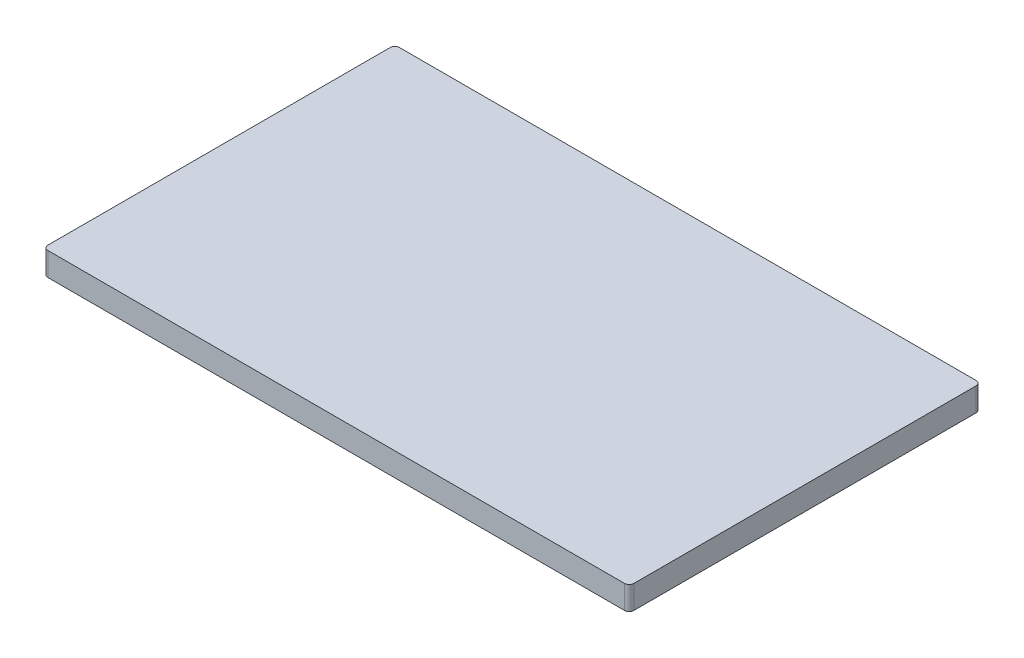
ISO-10303-21;
HEADER;
FILE_DESCRIPTION(('STEP AP214'),'2;1');
FILE_NAME('part.step','',(''),(''),'','','');
FILE_SCHEMA(('AUTOMOTIVE_DESIGN { 1 0 10303 214 1 1 1 1 }'));
ENDSEC;
DATA;
#1=APPLICATION_CONTEXT('core data for automotive mechanical design processes');
#2=APPLICATION_PROTOCOL_DEFINITION('international standard','automotive_design',2000,#1);
#3=PRODUCT_CONTEXT('',#1,'mechanical');
#4=PRODUCT('Part','Part','',(#3));
#5=PRODUCT_RELATED_PRODUCT_CATEGORY('part','',(#4));
#6=PRODUCT_DEFINITION_FORMATION('','',#4);
#7=PRODUCT_DEFINITION_CONTEXT('part definition',#1,'design');
#8=PRODUCT_DEFINITION('design','',#6,#7);
#9=PRODUCT_DEFINITION_SHAPE('','',#8);
#10=(LENGTH_UNIT() NAMED_UNIT(*) SI_UNIT(.MILLI.,.METRE.));
#11=(NAMED_UNIT(*) PLANE_ANGLE_UNIT() SI_UNIT($,.RADIAN.));
#12=(NAMED_UNIT(*) SI_UNIT($,.STERADIAN.) SOLID_ANGLE_UNIT());
#13=UNCERTAINTY_MEASURE_WITH_UNIT(LENGTH_MEASURE(1.E-05),#10,'distance_accuracy_value','');
#14=(GEOMETRIC_REPRESENTATION_CONTEXT(3) GLOBAL_UNCERTAINTY_ASSIGNED_CONTEXT((#13)) GLOBAL_UNIT_ASSIGNED_CONTEXT((#10,
#11,#12)) REPRESENTATION_CONTEXT('',''));
#15=CARTESIAN_POINT('',(0.,0.,0.));
#16=DIRECTION('',(0.,0.,1.));
#17=DIRECTION('',(1.,0.,0.));
#18=AXIS2_PLACEMENT_3D('',#15,#16,#17);
#19=CARTESIAN_POINT('',(0.,12.7,0.));
#20=DIRECTION('',(1.,0.,0.));
#21=DIRECTION('',(0.,0.,-1.));
#22=AXIS2_PLACEMENT_3D('',#19,#20,#21);
#23=PLANE('',#22);
#24=DIRECTION('',(0.,0.,1.));
#25=VECTOR('',#24,1.);
#26=CARTESIAN_POINT('',(0.,12.7,0.));
#27=LINE('',#26,#25);
#28=CARTESIAN_POINT('',(0.,12.7,-187.96));
#29=VERTEX_POINT('',#28);
#30=CARTESIAN_POINT('',(0.,12.7,-2.54));
#31=VERTEX_POINT('',#30);
#32=EDGE_CURVE('E131',#29,#31,#27,.T.);
#33=ORIENTED_EDGE('',*,*,#32,.F.);
#34=DIRECTION('',(0.,-1.,0.));
#35=VECTOR('',#34,1.);
#36=CARTESIAN_POINT('',(0.,12.7,-187.96));
#37=LINE('',#36,#35);
#38=CARTESIAN_POINT('',(0.,0.,-187.96));
#39=VERTEX_POINT('',#38);
#40=EDGE_CURVE('E115',#29,#39,#37,.T.);
#41=ORIENTED_EDGE('',*,*,#40,.T.);
#42=DIRECTION('',(0.,0.,1.));
#43=VECTOR('',#42,1.);
#44=CARTESIAN_POINT('',(0.,0.,0.));
#45=LINE('',#44,#43);
#46=CARTESIAN_POINT('',(0.,0.,-2.54));
#47=VERTEX_POINT('',#46);
#48=EDGE_CURVE('E128',#39,#47,#45,.T.);
#49=ORIENTED_EDGE('',*,*,#48,.T.);
#50=DIRECTION('',(0.,-1.,0.));
#51=VECTOR('',#50,1.);
#52=CARTESIAN_POINT('',(0.,12.7,-2.54));
#53=LINE('',#52,#51);
#54=EDGE_CURVE('E134',#47,#31,#53,.F.);
#55=ORIENTED_EDGE('',*,*,#54,.T.);
#56=EDGE_LOOP('',(#33,#41,#49,#55));
#57=FACE_BOUND('',#56,.T.);
#58=ADVANCED_FACE('F45',(#57),#23,.F.);
#59=CARTESIAN_POINT('',(0.,12.7,0.));
#60=DIRECTION('',(0.,0.,-1.));
#61=DIRECTION('',(-1.,0.,0.));
#62=AXIS2_PLACEMENT_3D('',#59,#60,#61);
#63=PLANE('',#62);
#64=DIRECTION('',(1.,0.,0.));
#65=VECTOR('',#64,1.);
#66=CARTESIAN_POINT('',(0.,12.7,0.));
#67=LINE('',#66,#65);
#68=CARTESIAN_POINT('',(2.54,12.7,0.));
#69=VERTEX_POINT('',#68);
#70=CARTESIAN_POINT('',(314.96,12.7,0.));
#71=VERTEX_POINT('',#70);
#72=EDGE_CURVE('E202',#69,#71,#67,.T.);
#73=ORIENTED_EDGE('',*,*,#72,.F.);
#74=DIRECTION('',(0.,-1.,0.));
#75=VECTOR('',#74,1.);
#76=CARTESIAN_POINT('',(2.54,12.7,0.));
#77=LINE('',#76,#75);
#78=CARTESIAN_POINT('',(2.54,0.,0.));
#79=VERTEX_POINT('',#78);
#80=EDGE_CURVE('E182',#69,#79,#77,.T.);
#81=ORIENTED_EDGE('',*,*,#80,.T.);
#82=DIRECTION('',(1.,0.,0.));
#83=VECTOR('',#82,1.);
#84=CARTESIAN_POINT('',(0.,0.,0.));
#85=LINE('',#84,#83);
#86=CARTESIAN_POINT('',(314.96,0.,0.));
#87=VERTEX_POINT('',#86);
#88=EDGE_CURVE('E139',#79,#87,#85,.T.);
#89=ORIENTED_EDGE('',*,*,#88,.T.);
#90=DIRECTION('',(0.,-1.,0.));
#91=VECTOR('',#90,1.);
#92=CARTESIAN_POINT('',(314.96,12.7,0.));
#93=LINE('',#92,#91);
#94=EDGE_CURVE('E179',#87,#71,#93,.F.);
#95=ORIENTED_EDGE('',*,*,#94,.T.);
#96=EDGE_LOOP('',(#73,#81,#89,#95));
#97=FACE_BOUND('',#96,.T.);
#98=ADVANCED_FACE('F214',(#97),#63,.F.);
#99=CARTESIAN_POINT('',(317.5,12.7,0.));
#100=DIRECTION('',(-1.,0.,0.));
#101=DIRECTION('',(0.,0.,1.));
#102=AXIS2_PLACEMENT_3D('',#99,#100,#101);
#103=PLANE('',#102);
#104=DIRECTION('',(0.,0.,-1.));
#105=VECTOR('',#104,1.);
#106=CARTESIAN_POINT('',(317.5,0.,0.));
#107=LINE('',#106,#105);
#108=CARTESIAN_POINT('',(317.5,0.,-2.54));
#109=VERTEX_POINT('',#108);
#110=CARTESIAN_POINT('',(317.5,0.,-187.96));
#111=VERTEX_POINT('',#110);
#112=EDGE_CURVE('E143',#109,#111,#107,.T.);
#113=ORIENTED_EDGE('',*,*,#112,.T.);
#114=DIRECTION('',(0.,-1.,0.));
#115=VECTOR('',#114,1.);
#116=CARTESIAN_POINT('',(317.5,12.7,-187.96));
#117=LINE('',#116,#115);
#118=CARTESIAN_POINT('',(317.5,12.7,-187.96));
#119=VERTEX_POINT('',#118);
#120=EDGE_CURVE('E11',#111,#119,#117,.F.);
#121=ORIENTED_EDGE('',*,*,#120,.T.);
#122=DIRECTION('',(0.,0.,-1.));
#123=VECTOR('',#122,1.);
#124=CARTESIAN_POINT('',(317.5,12.7,0.));
#125=LINE('',#124,#123);
#126=CARTESIAN_POINT('',(317.5,12.7,-2.54));
#127=VERTEX_POINT('',#126);
#128=EDGE_CURVE('E190',#127,#119,#125,.T.);
#129=ORIENTED_EDGE('',*,*,#128,.F.);
#130=DIRECTION('',(0.,-1.,0.));
#131=VECTOR('',#130,1.);
#132=CARTESIAN_POINT('',(317.5,12.7,-2.54));
#133=LINE('',#132,#131);
#134=EDGE_CURVE('E54',#127,#109,#133,.T.);
#135=ORIENTED_EDGE('',*,*,#134,.T.);
#136=EDGE_LOOP('',(#113,#121,#129,#135));
#137=FACE_BOUND('',#136,.T.);
#138=ADVANCED_FACE('F189',(#137),#103,.F.);
#139=CARTESIAN_POINT('',(0.,12.7,-190.5));
#140=DIRECTION('',(0.,0.,1.));
#141=DIRECTION('',(1.,0.,0.));
#142=AXIS2_PLACEMENT_3D('',#139,#140,#141);
#143=PLANE('',#142);
#144=DIRECTION('',(-1.,0.,0.));
#145=VECTOR('',#144,1.);
#146=CARTESIAN_POINT('',(0.,0.,-190.5));
#147=LINE('',#146,#145);
#148=CARTESIAN_POINT('',(314.96,0.,-190.5));
#149=VERTEX_POINT('',#148);
#150=CARTESIAN_POINT('',(2.54,0.,-190.5));
#151=VERTEX_POINT('',#150);
#152=EDGE_CURVE('E151',#149,#151,#147,.T.);
#153=ORIENTED_EDGE('',*,*,#152,.T.);
#154=DIRECTION('',(0.,-1.,0.));
#155=VECTOR('',#154,1.);
#156=CARTESIAN_POINT('',(2.54,12.7,-190.5));
#157=LINE('',#156,#155);
#158=CARTESIAN_POINT('',(2.54,12.7,-190.5));
#159=VERTEX_POINT('',#158);
#160=EDGE_CURVE('E116',#151,#159,#157,.F.);
#161=ORIENTED_EDGE('',*,*,#160,.T.);
#162=DIRECTION('',(-1.,0.,0.));
#163=VECTOR('',#162,1.);
#164=CARTESIAN_POINT('',(0.,12.7,-190.5));
#165=LINE('',#164,#163);
#166=CARTESIAN_POINT('',(314.96,12.7,-190.5));
#167=VERTEX_POINT('',#166);
#168=EDGE_CURVE('E146',#167,#159,#165,.T.);
#169=ORIENTED_EDGE('',*,*,#168,.F.);
#170=DIRECTION('',(0.,-1.,0.));
#171=VECTOR('',#170,1.);
#172=CARTESIAN_POINT('',(314.96,12.7,-190.5));
#173=LINE('',#172,#171);
#174=EDGE_CURVE('E122',#167,#149,#173,.T.);
#175=ORIENTED_EDGE('',*,*,#174,.T.);
#176=EDGE_LOOP('',(#153,#161,#169,#175));
#177=FACE_BOUND('',#176,.T.);
#178=ADVANCED_FACE('F198',(#177),#143,.F.);
#179=CARTESIAN_POINT('',(0.,12.7,0.));
#180=DIRECTION('',(0.,-1.,0.));
#181=DIRECTION('',(0.,0.,-1.));
#182=AXIS2_PLACEMENT_3D('',#179,#180,#181);
#183=PLANE('',#182);
#184=ORIENTED_EDGE('',*,*,#168,.T.);
#185=CARTESIAN_POINT('',(2.54,12.7,-187.96));
#186=DIRECTION('',(0.,-1.,0.));
#187=DIRECTION('',(0.,0.,-1.));
#188=AXIS2_PLACEMENT_3D('',#185,#186,#187);
#189=CIRCLE('',#188,2.54);
#190=EDGE_CURVE('E176',#159,#29,#189,.F.);
#191=ORIENTED_EDGE('',*,*,#190,.T.);
#192=ORIENTED_EDGE('',*,*,#32,.T.);
#193=CARTESIAN_POINT('',(2.54,12.7,-2.54));
#194=DIRECTION('',(0.,-1.,0.));
#195=DIRECTION('',(0.,0.,-1.));
#196=AXIS2_PLACEMENT_3D('',#193,#194,#195);
#197=CIRCLE('',#196,2.54);
#198=EDGE_CURVE('E173',#31,#69,#197,.F.);
#199=ORIENTED_EDGE('',*,*,#198,.T.);
#200=ORIENTED_EDGE('',*,*,#72,.T.);
#201=CARTESIAN_POINT('',(314.96,12.7,-2.54));
#202=DIRECTION('',(0.,-1.,0.));
#203=DIRECTION('',(0.,0.,-1.));
#204=AXIS2_PLACEMENT_3D('',#201,#202,#203);
#205=CIRCLE('',#204,2.54);
#206=EDGE_CURVE('E66',#71,#127,#205,.F.);
#207=ORIENTED_EDGE('',*,*,#206,.T.);
#208=ORIENTED_EDGE('',*,*,#128,.T.);
#209=CARTESIAN_POINT('',(314.96,12.7,-187.96));
#210=DIRECTION('',(0.,-1.,0.));
#211=DIRECTION('',(0.,0.,-1.));
#212=AXIS2_PLACEMENT_3D('',#209,#210,#211);
#213=CIRCLE('',#212,2.54);
#214=EDGE_CURVE('E170',#119,#167,#213,.F.);
#215=ORIENTED_EDGE('',*,*,#214,.T.);
#216=EDGE_LOOP('',(#184,#191,#192,#199,#200,#207,#208,#215));
#217=FACE_BOUND('',#216,.T.);
#218=ADVANCED_FACE('F208',(#217),#183,.F.);
#219=CARTESIAN_POINT('',(0.,0.,0.));
#220=DIRECTION('',(0.,-1.,0.));
#221=DIRECTION('',(0.,0.,-1.));
#222=AXIS2_PLACEMENT_3D('',#219,#220,#221);
#223=PLANE('',#222);
#224=ORIENTED_EDGE('',*,*,#48,.F.);
#225=CARTESIAN_POINT('',(2.54,0.,-187.96));
#226=DIRECTION('',(0.,-1.,0.));
#227=DIRECTION('',(0.,0.,-1.));
#228=AXIS2_PLACEMENT_3D('',#225,#226,#227);
#229=CIRCLE('',#228,2.54);
#230=EDGE_CURVE('E111',#39,#151,#229,.T.);
#231=ORIENTED_EDGE('',*,*,#230,.T.);
#232=ORIENTED_EDGE('',*,*,#152,.F.);
#233=CARTESIAN_POINT('',(314.96,0.,-187.96));
#234=DIRECTION('',(0.,-1.,0.));
#235=DIRECTION('',(0.,0.,-1.));
#236=AXIS2_PLACEMENT_3D('',#233,#234,#235);
#237=CIRCLE('',#236,2.54);
#238=EDGE_CURVE('E158',#149,#111,#237,.T.);
#239=ORIENTED_EDGE('',*,*,#238,.T.);
#240=ORIENTED_EDGE('',*,*,#112,.F.);
#241=CARTESIAN_POINT('',(314.96,0.,-2.54));
#242=DIRECTION('',(0.,-1.,0.));
#243=DIRECTION('',(0.,0.,-1.));
#244=AXIS2_PLACEMENT_3D('',#241,#242,#243);
#245=CIRCLE('',#244,2.54);
#246=EDGE_CURVE('E133',#109,#87,#245,.T.);
#247=ORIENTED_EDGE('',*,*,#246,.T.);
#248=ORIENTED_EDGE('',*,*,#88,.F.);
#249=CARTESIAN_POINT('',(2.54,0.,-2.54));
#250=DIRECTION('',(0.,-1.,0.));
#251=DIRECTION('',(0.,0.,-1.));
#252=AXIS2_PLACEMENT_3D('',#249,#250,#251);
#253=CIRCLE('',#252,2.54);
#254=EDGE_CURVE('E123',#79,#47,#253,.T.);
#255=ORIENTED_EDGE('',*,*,#254,.T.);
#256=EDGE_LOOP('',(#224,#231,#232,#239,#240,#247,#248,#255));
#257=FACE_BOUND('',#256,.T.);
#258=ADVANCED_FACE('F136',(#257),#223,.T.);
#259=CARTESIAN_POINT('',(2.54,12.7,-187.96));
#260=DIRECTION('',(0.,-1.,0.));
#261=DIRECTION('',(0.,0.,-1.));
#262=AXIS2_PLACEMENT_3D('',#259,#260,#261);
#263=CYLINDRICAL_SURFACE('',#262,2.54);
#264=ORIENTED_EDGE('',*,*,#190,.F.);
#265=ORIENTED_EDGE('',*,*,#160,.F.);
#266=ORIENTED_EDGE('',*,*,#230,.F.);
#267=ORIENTED_EDGE('',*,*,#40,.F.);
#268=EDGE_LOOP('',(#264,#265,#266,#267));
#269=FACE_BOUND('',#268,.T.);
#270=ADVANCED_FACE('F114',(#269),#263,.T.);
#271=CARTESIAN_POINT('',(2.54,12.7,-2.54));
#272=DIRECTION('',(0.,-1.,0.));
#273=DIRECTION('',(0.,0.,-1.));
#274=AXIS2_PLACEMENT_3D('',#271,#272,#273);
#275=CYLINDRICAL_SURFACE('',#274,2.54);
#276=ORIENTED_EDGE('',*,*,#198,.F.);
#277=ORIENTED_EDGE('',*,*,#54,.F.);
#278=ORIENTED_EDGE('',*,*,#254,.F.);
#279=ORIENTED_EDGE('',*,*,#80,.F.);
#280=EDGE_LOOP('',(#276,#277,#278,#279));
#281=FACE_BOUND('',#280,.T.);
#282=ADVANCED_FACE('F212',(#281),#275,.T.);
#283=CARTESIAN_POINT('',(314.96,12.7,-187.96));
#284=DIRECTION('',(0.,-1.,0.));
#285=DIRECTION('',(0.,0.,-1.));
#286=AXIS2_PLACEMENT_3D('',#283,#284,#285);
#287=CYLINDRICAL_SURFACE('',#286,2.54);
#288=ORIENTED_EDGE('',*,*,#214,.F.);
#289=ORIENTED_EDGE('',*,*,#120,.F.);
#290=ORIENTED_EDGE('',*,*,#238,.F.);
#291=ORIENTED_EDGE('',*,*,#174,.F.);
#292=EDGE_LOOP('',(#288,#289,#290,#291));
#293=FACE_BOUND('',#292,.T.);
#294=ADVANCED_FACE('F195',(#293),#287,.T.);
#295=CARTESIAN_POINT('',(314.96,12.7,-2.54));
#296=DIRECTION('',(0.,-1.,0.));
#297=DIRECTION('',(0.,0.,-1.));
#298=AXIS2_PLACEMENT_3D('',#295,#296,#297);
#299=CYLINDRICAL_SURFACE('',#298,2.54);
#300=ORIENTED_EDGE('',*,*,#206,.F.);
#301=ORIENTED_EDGE('',*,*,#94,.F.);
#302=ORIENTED_EDGE('',*,*,#246,.F.);
#303=ORIENTED_EDGE('',*,*,#134,.F.);
#304=EDGE_LOOP('',(#300,#301,#302,#303));
#305=FACE_BOUND('',#304,.T.);
#306=ADVANCED_FACE('F47',(#305),#299,.T.);
#307=CLOSED_SHELL('',(#58,#98,#138,#178,#218,#258,#270,#282,#294,#306));
#308=MANIFOLD_SOLID_BREP('B2',#307);
#309=ADVANCED_BREP_SHAPE_REPRESENTATION('',(#18,#308),#14);
#310=SHAPE_DEFINITION_REPRESENTATION(#9,#309);
ENDSEC;
END-ISO-10303-21;
